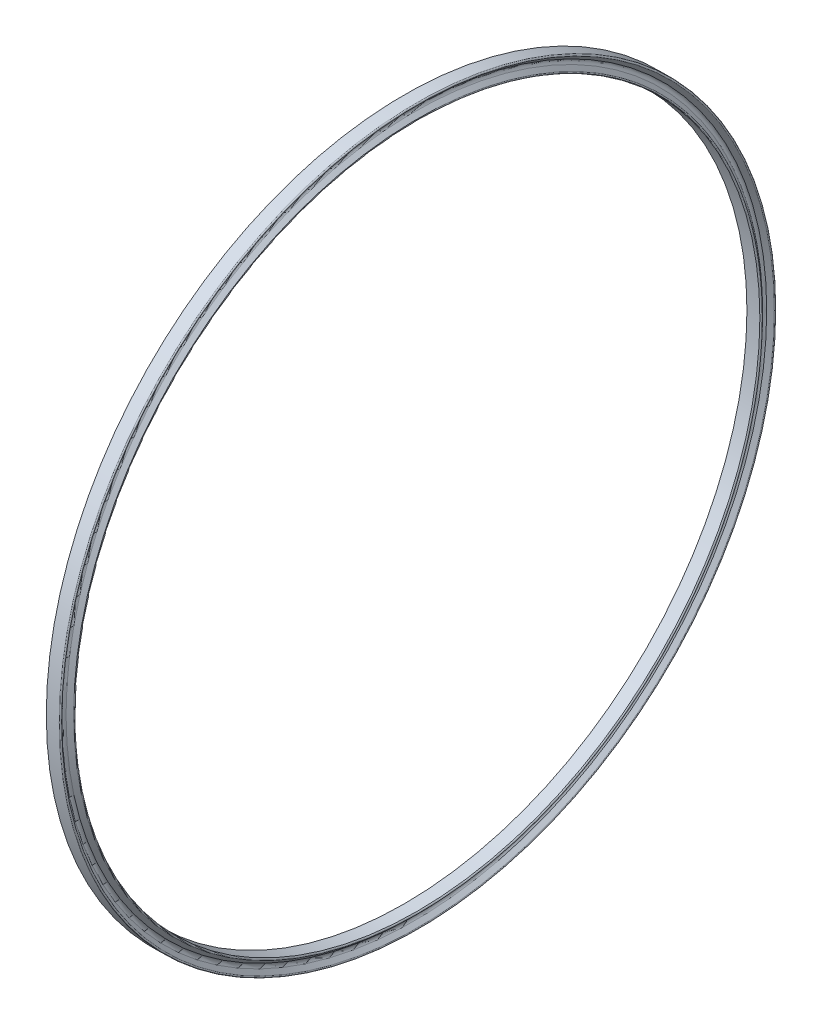
ISO-10303-21;
HEADER;
FILE_DESCRIPTION(('STEP AP214'),'2;1');
FILE_NAME('part.step','',(''),(''),'','','');
FILE_SCHEMA(('AUTOMOTIVE_DESIGN { 1 0 10303 214 1 1 1 1 }'));
ENDSEC;
DATA;
#1=APPLICATION_CONTEXT('core data for automotive mechanical design processes');
#2=APPLICATION_PROTOCOL_DEFINITION('international standard','automotive_design',2000,#1);
#3=PRODUCT_CONTEXT('',#1,'mechanical');
#4=PRODUCT('Part','Part','',(#3));
#5=PRODUCT_RELATED_PRODUCT_CATEGORY('part','',(#4));
#6=PRODUCT_DEFINITION_FORMATION('','',#4);
#7=PRODUCT_DEFINITION_CONTEXT('part definition',#1,'design');
#8=PRODUCT_DEFINITION('design','',#6,#7);
#9=PRODUCT_DEFINITION_SHAPE('','',#8);
#10=(LENGTH_UNIT() NAMED_UNIT(*) SI_UNIT(.MILLI.,.METRE.));
#11=(NAMED_UNIT(*) PLANE_ANGLE_UNIT() SI_UNIT($,.RADIAN.));
#12=(NAMED_UNIT(*) SI_UNIT($,.STERADIAN.) SOLID_ANGLE_UNIT());
#13=UNCERTAINTY_MEASURE_WITH_UNIT(LENGTH_MEASURE(1.E-05),#10,'distance_accuracy_value','');
#14=(GEOMETRIC_REPRESENTATION_CONTEXT(3) GLOBAL_UNCERTAINTY_ASSIGNED_CONTEXT((#13)) GLOBAL_UNIT_ASSIGNED_CONTEXT((#10,
#11,#12)) REPRESENTATION_CONTEXT('',''));
#15=CARTESIAN_POINT('',(0.,0.,0.));
#16=DIRECTION('',(0.,0.,1.));
#17=DIRECTION('',(1.,0.,0.));
#18=AXIS2_PLACEMENT_3D('',#15,#16,#17);
#19=CARTESIAN_POINT('',(27.2331740984558,0.,0.));
#20=DIRECTION('',(-1.,0.,0.));
#21=DIRECTION('',(0.,0.,1.));
#22=AXIS2_PLACEMENT_3D('',#19,#20,#21);
#23=TOROIDAL_SURFACE('',#22,34.08,0.300000000000003);
#24=CARTESIAN_POINT('',(27.0210420640998,0.,0.));
#25=DIRECTION('',(-1.,0.,0.));
#26=DIRECTION('',(0.,0.,1.));
#27=AXIS2_PLACEMENT_3D('',#24,#25,#26);
#28=CIRCLE('',#27,33.867867965644);
#29=CARTESIAN_POINT('',(27.0210420640998,0.,33.867867965644));
#30=VERTEX_POINT('',#29);
#31=EDGE_CURVE('E10',#30,#30,#28,.T.);
#32=ORIENTED_EDGE('',*,*,#31,.T.);
#33=EDGE_LOOP('',(#32));
#34=FACE_BOUND('',#33,.T.);
#35=CARTESIAN_POINT('',(27.0210420640998,0.,0.));
#36=DIRECTION('',(-1.,0.,0.));
#37=DIRECTION('',(0.,0.,1.));
#38=AXIS2_PLACEMENT_3D('',#35,#36,#37);
#39=CIRCLE('',#38,34.292132034356);
#40=CARTESIAN_POINT('',(27.0210420640998,0.,34.292132034356));
#41=VERTEX_POINT('',#40);
#42=EDGE_CURVE('E72',#41,#41,#39,.T.);
#43=ORIENTED_EDGE('',*,*,#42,.F.);
#44=EDGE_LOOP('',(#43));
#45=FACE_BOUND('',#44,.T.);
#46=ADVANCED_FACE('F34',(#34,#45),#23,.F.);
#47=CARTESIAN_POINT('',(27.0210420640998,0.,0.));
#48=DIRECTION('',(-1.,0.,0.));
#49=DIRECTION('',(0.,0.,1.));
#50=AXIS2_PLACEMENT_3D('',#47,#48,#49);
#51=CONICAL_SURFACE('',#50,33.867867965644,0.785398163397439);
#52=CARTESIAN_POINT('',(27.3881993516252,0.,0.));
#53=DIRECTION('',(-1.,0.,0.));
#54=DIRECTION('',(0.,0.,1.));
#55=AXIS2_PLACEMENT_3D('',#52,#53,#54);
#56=CIRCLE('',#55,33.5007106781187);
#57=CARTESIAN_POINT('',(27.3881993516252,0.,33.5007106781187));
#58=VERTEX_POINT('',#57);
#59=EDGE_CURVE('E41',#58,#58,#56,.T.);
#60=ORIENTED_EDGE('',*,*,#59,.T.);
#61=EDGE_LOOP('',(#60));
#62=FACE_BOUND('',#61,.T.);
#63=ORIENTED_EDGE('',*,*,#31,.F.);
#64=EDGE_LOOP('',(#63));
#65=FACE_BOUND('',#64,.T.);
#66=ADVANCED_FACE('F82',(#62,#65),#51,.T.);
#67=CARTESIAN_POINT('',(27.3174886735066,0.,0.));
#68=DIRECTION('',(-1.,0.,0.));
#69=DIRECTION('',(0.,0.,1.));
#70=AXIS2_PLACEMENT_3D('',#67,#68,#69);
#71=TOROIDAL_SURFACE('',#70,33.43,0.0999999999999966);
#72=CARTESIAN_POINT('',(27.3174886735065,0.,0.));
#73=DIRECTION('',(-1.,0.,0.));
#74=DIRECTION('',(0.,0.,1.));
#75=AXIS2_PLACEMENT_3D('',#72,#73,#74);
#76=CIRCLE('',#75,33.33);
#77=CARTESIAN_POINT('',(27.3174886735065,0.,33.33));
#78=VERTEX_POINT('',#77);
#79=EDGE_CURVE('E48',#78,#78,#76,.T.);
#80=ORIENTED_EDGE('',*,*,#79,.T.);
#81=EDGE_LOOP('',(#80));
#82=FACE_BOUND('',#81,.T.);
#83=ORIENTED_EDGE('',*,*,#59,.F.);
#84=EDGE_LOOP('',(#83));
#85=FACE_BOUND('',#84,.T.);
#86=ADVANCED_FACE('F86',(#82,#85),#71,.T.);
#87=CARTESIAN_POINT('',(-75.5757605410783,0.,0.));
#88=DIRECTION('',(-1.,0.,0.));
#89=DIRECTION('',(0.,0.,1.));
#90=AXIS2_PLACEMENT_3D('',#87,#88,#89);
#91=CYLINDRICAL_SURFACE('',#90,33.33);
#92=CARTESIAN_POINT('',(26.0589100297439,0.,0.));
#93=DIRECTION('',(-1.,0.,0.));
#94=DIRECTION('',(0.,0.,1.));
#95=AXIS2_PLACEMENT_3D('',#92,#93,#94);
#96=CIRCLE('',#95,33.33);
#97=CARTESIAN_POINT('',(26.0589100297439,0.,33.33));
#98=VERTEX_POINT('',#97);
#99=EDGE_CURVE('E54',#98,#98,#96,.T.);
#100=ORIENTED_EDGE('',*,*,#99,.T.);
#101=EDGE_LOOP('',(#100));
#102=FACE_BOUND('',#101,.T.);
#103=ORIENTED_EDGE('',*,*,#79,.F.);
#104=EDGE_LOOP('',(#103));
#105=FACE_BOUND('',#104,.T.);
#106=ADVANCED_FACE('F90',(#102,#105),#91,.F.);
#107=CARTESIAN_POINT('',(26.0589100297439,-34.83,0.));
#108=DIRECTION('',(-1.,0.,0.));
#109=DIRECTION('',(0.,0.,1.));
#110=AXIS2_PLACEMENT_3D('',#107,#108,#109);
#111=PLANE('',#110);
#112=CARTESIAN_POINT('',(26.0589100297439,0.,0.));
#113=DIRECTION('',(-1.,0.,0.));
#114=DIRECTION('',(0.,0.,1.));
#115=AXIS2_PLACEMENT_3D('',#112,#113,#114);
#116=CIRCLE('',#115,34.83);
#117=CARTESIAN_POINT('',(26.0589100297439,0.,34.83));
#118=VERTEX_POINT('',#117);
#119=EDGE_CURVE('E60',#118,#118,#116,.T.);
#120=ORIENTED_EDGE('',*,*,#119,.T.);
#121=EDGE_LOOP('',(#120));
#122=FACE_BOUND('',#121,.T.);
#123=ORIENTED_EDGE('',*,*,#99,.F.);
#124=EDGE_LOOP('',(#123));
#125=FACE_BOUND('',#124,.T.);
#126=ADVANCED_FACE('F97',(#122,#125),#111,.T.);
#127=CARTESIAN_POINT('',(-75.5757605410783,0.,0.));
#128=DIRECTION('',(-1.,0.,0.));
#129=DIRECTION('',(0.,0.,1.));
#130=AXIS2_PLACEMENT_3D('',#127,#128,#129);
#131=CYLINDRICAL_SURFACE('',#130,34.83);
#132=CARTESIAN_POINT('',(27.3174886735065,0.,0.));
#133=DIRECTION('',(-1.,0.,0.));
#134=DIRECTION('',(0.,0.,1.));
#135=AXIS2_PLACEMENT_3D('',#132,#133,#134);
#136=CIRCLE('',#135,34.83);
#137=CARTESIAN_POINT('',(27.3174886735065,0.,34.83));
#138=VERTEX_POINT('',#137);
#139=EDGE_CURVE('E64',#138,#138,#136,.T.);
#140=ORIENTED_EDGE('',*,*,#139,.T.);
#141=EDGE_LOOP('',(#140));
#142=FACE_BOUND('',#141,.T.);
#143=ORIENTED_EDGE('',*,*,#119,.F.);
#144=EDGE_LOOP('',(#143));
#145=FACE_BOUND('',#144,.T.);
#146=ADVANCED_FACE('F101',(#142,#145),#131,.T.);
#147=CARTESIAN_POINT('',(27.3174886735065,0.,0.));
#148=DIRECTION('',(-1.,0.,0.));
#149=DIRECTION('',(0.,0.,1.));
#150=AXIS2_PLACEMENT_3D('',#147,#148,#149);
#151=TOROIDAL_SURFACE('',#150,34.73,0.1);
#152=CARTESIAN_POINT('',(27.3881993516252,0.,0.));
#153=DIRECTION('',(-1.,0.,0.));
#154=DIRECTION('',(0.,0.,1.));
#155=AXIS2_PLACEMENT_3D('',#152,#153,#154);
#156=CIRCLE('',#155,34.6592893218813);
#157=CARTESIAN_POINT('',(27.3881993516252,0.,34.6592893218813));
#158=VERTEX_POINT('',#157);
#159=EDGE_CURVE('E68',#158,#158,#156,.T.);
#160=ORIENTED_EDGE('',*,*,#159,.T.);
#161=EDGE_LOOP('',(#160));
#162=FACE_BOUND('',#161,.T.);
#163=ORIENTED_EDGE('',*,*,#139,.F.);
#164=EDGE_LOOP('',(#163));
#165=FACE_BOUND('',#164,.T.);
#166=ADVANCED_FACE('F105',(#162,#165),#151,.T.);
#167=CARTESIAN_POINT('',(27.3881993516252,0.,0.));
#168=DIRECTION('',(1.,0.,0.));
#169=DIRECTION('',(0.,0.,-1.));
#170=AXIS2_PLACEMENT_3D('',#167,#168,#169);
#171=CONICAL_SURFACE('',#170,34.6592893218813,0.785398163397439);
#172=ORIENTED_EDGE('',*,*,#42,.T.);
#173=EDGE_LOOP('',(#172));
#174=FACE_BOUND('',#173,.T.);
#175=ORIENTED_EDGE('',*,*,#159,.F.);
#176=EDGE_LOOP('',(#175));
#177=FACE_BOUND('',#176,.T.);
#178=ADVANCED_FACE('F78',(#174,#177),#171,.F.);
#179=CLOSED_SHELL('',(#46,#66,#86,#106,#126,#146,#166,#178));
#180=MANIFOLD_SOLID_BREP('B2',#179);
#181=ADVANCED_BREP_SHAPE_REPRESENTATION('',(#18,#180),#14);
#182=SHAPE_DEFINITION_REPRESENTATION(#9,#181);
ENDSEC;
END-ISO-10303-21;
